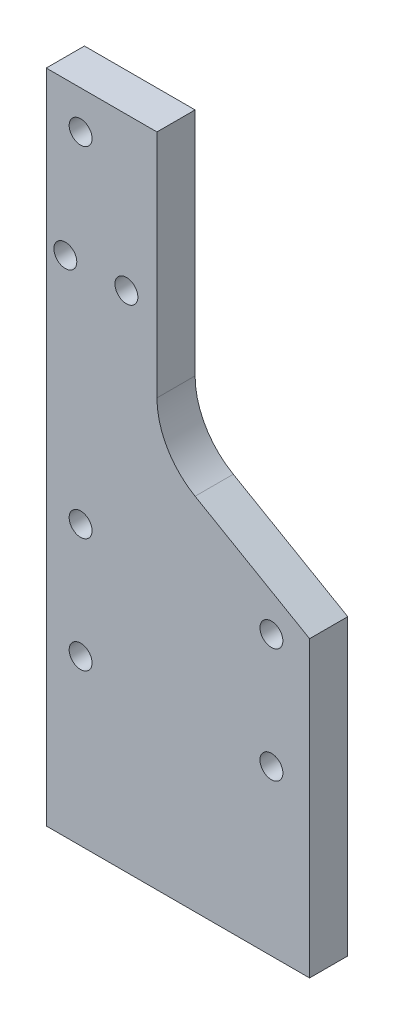
ISO-10303-21;
HEADER;
FILE_DESCRIPTION(('STEP AP214'),'2;1');
FILE_NAME('part.step','',(''),(''),'','','');
FILE_SCHEMA(('AUTOMOTIVE_DESIGN { 1 0 10303 214 1 1 1 1 }'));
ENDSEC;
DATA;
#1=APPLICATION_CONTEXT('core data for automotive mechanical design processes');
#2=APPLICATION_PROTOCOL_DEFINITION('international standard','automotive_design',2000,#1);
#3=PRODUCT_CONTEXT('',#1,'mechanical');
#4=PRODUCT('Part','Part','',(#3));
#5=PRODUCT_RELATED_PRODUCT_CATEGORY('part','',(#4));
#6=PRODUCT_DEFINITION_FORMATION('','',#4);
#7=PRODUCT_DEFINITION_CONTEXT('part definition',#1,'design');
#8=PRODUCT_DEFINITION('design','',#6,#7);
#9=PRODUCT_DEFINITION_SHAPE('','',#8);
#10=(LENGTH_UNIT() NAMED_UNIT(*) SI_UNIT(.MILLI.,.METRE.));
#11=(NAMED_UNIT(*) PLANE_ANGLE_UNIT() SI_UNIT($,.RADIAN.));
#12=(NAMED_UNIT(*) SI_UNIT($,.STERADIAN.) SOLID_ANGLE_UNIT());
#13=UNCERTAINTY_MEASURE_WITH_UNIT(LENGTH_MEASURE(1.E-05),#10,'distance_accuracy_value','');
#14=(GEOMETRIC_REPRESENTATION_CONTEXT(3) GLOBAL_UNCERTAINTY_ASSIGNED_CONTEXT((#13)) GLOBAL_UNIT_ASSIGNED_CONTEXT((#10,
#11,#12)) REPRESENTATION_CONTEXT('',''));
#15=CARTESIAN_POINT('',(0.,0.,0.));
#16=DIRECTION('',(0.,0.,1.));
#17=DIRECTION('',(1.,0.,0.));
#18=AXIS2_PLACEMENT_3D('',#15,#16,#17);
#19=CARTESIAN_POINT('',(-20.0000000000004,128.641016151377,-10.0000000000006));
#20=DIRECTION('',(0.,0.,-1.));
#21=DIRECTION('',(1.,0.,0.));
#22=AXIS2_PLACEMENT_3D('',#19,#20,#21);
#23=PLANE('',#22);
#24=DIRECTION('',(-1.,0.,0.));
#25=VECTOR('',#24,1.);
#26=CARTESIAN_POINT('',(-69.0000000000017,17.,-9.99999999999956));
#27=LINE('',#26,#25);
#28=CARTESIAN_POINT('',(1.38777878078145E-13,17.,-9.9999999999969));
#29=VERTEX_POINT('',#28);
#30=CARTESIAN_POINT('',(-69.0000000000017,17.,-9.99999999999956));
#31=VERTEX_POINT('',#30);
#32=EDGE_CURVE('E160',#29,#31,#27,.T.);
#33=ORIENTED_EDGE('',*,*,#32,.T.);
#34=DIRECTION('',(0.,-1.,0.));
#35=VECTOR('',#34,1.);
#36=CARTESIAN_POINT('',(-69.0000000000017,0.,-9.99999999999956));
#37=LINE('',#36,#35);
#38=CARTESIAN_POINT('',(-69.0000000000016,189.,-9.99999999999956));
#39=VERTEX_POINT('',#38);
#40=EDGE_CURVE('E119',#39,#31,#37,.T.);
#41=ORIENTED_EDGE('',*,*,#40,.F.);
#42=DIRECTION('',(-1.,0.,0.));
#43=VECTOR('',#42,1.);
#44=CARTESIAN_POINT('',(-69.0000000000016,189.,-9.99999999999956));
#45=LINE('',#44,#43);
#46=CARTESIAN_POINT('',(-40.0000000000004,189.,-10.0000000000025));
#47=VERTEX_POINT('',#46);
#48=EDGE_CURVE('E117',#47,#39,#45,.T.);
#49=ORIENTED_EDGE('',*,*,#48,.F.);
#50=DIRECTION('',(0.,1.,0.));
#51=VECTOR('',#50,1.);
#52=CARTESIAN_POINT('',(-40.0000000000004,189.,-10.0000000000025));
#53=LINE('',#52,#51);
#54=CARTESIAN_POINT('',(-39.9999999999996,128.641016151377,-10.0000000000012));
#55=VERTEX_POINT('',#54);
#56=EDGE_CURVE('E98',#55,#47,#53,.T.);
#57=ORIENTED_EDGE('',*,*,#56,.F.);
#58=CARTESIAN_POINT('',(-20.0000000000004,128.641016151377,-10.0000000000006));
#59=DIRECTION('',(0.,0.,-1.));
#60=DIRECTION('',(1.,0.,0.));
#61=AXIS2_PLACEMENT_3D('',#58,#59,#60);
#62=CIRCLE('',#61,20.);
#63=CARTESIAN_POINT('',(-30.0000000000012,111.320508075689,-10.0000000000026));
#64=VERTEX_POINT('',#63);
#65=EDGE_CURVE('E108',#64,#55,#62,.T.);
#66=ORIENTED_EDGE('',*,*,#65,.F.);
#67=DIRECTION('',(-0.86602540378445,0.499999999999998,0.));
#68=VECTOR('',#67,1.);
#69=CARTESIAN_POINT('',(-30.0000000000012,111.320508075689,-10.0000000000026));
#70=LINE('',#69,#68);
#71=CARTESIAN_POINT('',(0.,94.,-9.99999999999679));
#72=VERTEX_POINT('',#71);
#73=EDGE_CURVE('E112',#72,#64,#70,.T.);
#74=ORIENTED_EDGE('',*,*,#73,.F.);
#75=DIRECTION('',(0.,1.,0.));
#76=VECTOR('',#75,1.);
#77=CARTESIAN_POINT('',(0.,94.,-9.99999999999679));
#78=LINE('',#77,#76);
#79=EDGE_CURVE('E140',#29,#72,#78,.T.);
#80=ORIENTED_EDGE('',*,*,#79,.F.);
#81=EDGE_LOOP('',(#33,#41,#49,#57,#66,#74,#80));
#82=FACE_BOUND('',#81,.T.);
#83=CARTESIAN_POINT('',(-48.0000000000005,149.,-9.99999999999734));
#84=DIRECTION('',(0.,0.,1.));
#85=DIRECTION('',(1.,0.,0.));
#86=AXIS2_PLACEMENT_3D('',#83,#84,#85);
#87=CIRCLE('',#86,3.);
#88=CARTESIAN_POINT('',(-45.0000000000005,149.,-9.99999999999735));
#89=VERTEX_POINT('',#88);
#90=EDGE_CURVE('E172',#89,#89,#87,.T.);
#91=ORIENTED_EDGE('',*,*,#90,.T.);
#92=EDGE_LOOP('',(#91));
#93=FACE_BOUND('',#92,.T.);
#94=CARTESIAN_POINT('',(-10.000000000001,90.,-9.99999999999934));
#95=DIRECTION('',(0.,0.,1.));
#96=DIRECTION('',(1.,0.,0.));
#97=AXIS2_PLACEMENT_3D('',#94,#95,#96);
#98=CIRCLE('',#97,3.);
#99=CARTESIAN_POINT('',(-7.00000000000099,90.,-9.99999999999935));
#100=VERTEX_POINT('',#99);
#101=EDGE_CURVE('E184',#100,#100,#98,.T.);
#102=ORIENTED_EDGE('',*,*,#101,.T.);
#103=EDGE_LOOP('',(#102));
#104=FACE_BOUND('',#103,.T.);
#105=CARTESIAN_POINT('',(-10.000000000001,59.9999999999999,-9.99999999999934));
#106=DIRECTION('',(0.,0.,1.));
#107=DIRECTION('',(1.,0.,0.));
#108=AXIS2_PLACEMENT_3D('',#105,#106,#107);
#109=CIRCLE('',#108,3.);
#110=CARTESIAN_POINT('',(-7.00000000000101,59.9999999999999,-9.99999999999935));
#111=VERTEX_POINT('',#110);
#112=EDGE_CURVE('E196',#111,#111,#109,.T.);
#113=ORIENTED_EDGE('',*,*,#112,.T.);
#114=EDGE_LOOP('',(#113));
#115=FACE_BOUND('',#114,.T.);
#116=CARTESIAN_POINT('',(-60.0000000000005,59.9999999999999,-10.0000000000011));
#117=DIRECTION('',(0.,0.,1.));
#118=DIRECTION('',(1.,0.,0.));
#119=AXIS2_PLACEMENT_3D('',#116,#117,#118);
#120=CIRCLE('',#119,3.);
#121=CARTESIAN_POINT('',(-57.0000000000005,59.9999999999999,-10.0000000000011));
#122=VERTEX_POINT('',#121);
#123=EDGE_CURVE('E128',#122,#122,#120,.T.);
#124=ORIENTED_EDGE('',*,*,#123,.T.);
#125=EDGE_LOOP('',(#124));
#126=FACE_BOUND('',#125,.T.);
#127=CARTESIAN_POINT('',(-60.0000000000001,90.,-10.0000000000016));
#128=DIRECTION('',(0.,0.,1.));
#129=DIRECTION('',(1.,0.,0.));
#130=AXIS2_PLACEMENT_3D('',#127,#128,#129);
#131=CIRCLE('',#130,3.);
#132=CARTESIAN_POINT('',(-57.0000000000001,90.,-10.0000000000016));
#133=VERTEX_POINT('',#132);
#134=EDGE_CURVE('E190',#133,#133,#131,.T.);
#135=ORIENTED_EDGE('',*,*,#134,.T.);
#136=EDGE_LOOP('',(#135));
#137=FACE_BOUND('',#136,.T.);
#138=CARTESIAN_POINT('',(-64.0000000000006,149.,-10.0000000000027));
#139=DIRECTION('',(0.,0.,1.));
#140=DIRECTION('',(1.,0.,0.));
#141=AXIS2_PLACEMENT_3D('',#138,#139,#140);
#142=CIRCLE('',#141,3.);
#143=CARTESIAN_POINT('',(-61.0000000000006,149.,-10.0000000000027));
#144=VERTEX_POINT('',#143);
#145=EDGE_CURVE('E178',#144,#144,#142,.T.);
#146=ORIENTED_EDGE('',*,*,#145,.T.);
#147=EDGE_LOOP('',(#146));
#148=FACE_BOUND('',#147,.T.);
#149=CARTESIAN_POINT('',(-60.0000000000007,179.,-10.0000000000026));
#150=DIRECTION('',(0.,0.,1.));
#151=DIRECTION('',(1.,0.,0.));
#152=AXIS2_PLACEMENT_3D('',#149,#150,#151);
#153=CIRCLE('',#152,3.);
#154=CARTESIAN_POINT('',(-57.0000000000007,179.,-10.0000000000026));
#155=VERTEX_POINT('',#154);
#156=EDGE_CURVE('E166',#155,#155,#153,.T.);
#157=ORIENTED_EDGE('',*,*,#156,.T.);
#158=EDGE_LOOP('',(#157));
#159=FACE_BOUND('',#158,.T.);
#160=ADVANCED_FACE('F33',(#82,#93,#104,#115,#126,#137,#148,#159),#23,.T.);
#161=CARTESIAN_POINT('',(-20.0000000000005,128.641016151377,5.55111512312578E-13));
#162=DIRECTION('',(0.,0.,-1.));
#163=DIRECTION('',(1.,0.,0.));
#164=AXIS2_PLACEMENT_3D('',#161,#162,#163);
#165=PLANE('',#164);
#166=CARTESIAN_POINT('',(-48.0000000000006,149.,-1.4432899320127E-12));
#167=DIRECTION('',(0.,0.,1.));
#168=DIRECTION('',(1.,0.,0.));
#169=AXIS2_PLACEMENT_3D('',#166,#167,#168);
#170=CIRCLE('',#169,3.);
#171=CARTESIAN_POINT('',(-45.0000000000006,149.,-1.44916023625541E-12));
#172=VERTEX_POINT('',#171);
#173=EDGE_CURVE('E169',#172,#172,#170,.T.);
#174=ORIENTED_EDGE('',*,*,#173,.F.);
#175=EDGE_LOOP('',(#174));
#176=FACE_BOUND('',#175,.T.);
#177=CARTESIAN_POINT('',(-10.0000000000003,90.,-2.99760216648792E-12));
#178=DIRECTION('',(0.,0.,1.));
#179=DIRECTION('',(1.,0.,0.));
#180=AXIS2_PLACEMENT_3D('',#177,#178,#179);
#181=CIRCLE('',#180,3.);
#182=CARTESIAN_POINT('',(-7.00000000000029,90.,-3.00347247073063E-12));
#183=VERTEX_POINT('',#182);
#184=EDGE_CURVE('E181',#183,#183,#181,.T.);
#185=ORIENTED_EDGE('',*,*,#184,.F.);
#186=EDGE_LOOP('',(#185));
#187=FACE_BOUND('',#186,.T.);
#188=CARTESIAN_POINT('',(-10.0000000000013,60.,-3.10862446895044E-12));
#189=DIRECTION('',(0.,0.,1.));
#190=DIRECTION('',(1.,0.,0.));
#191=AXIS2_PLACEMENT_3D('',#188,#189,#190);
#192=CIRCLE('',#191,3.);
#193=CARTESIAN_POINT('',(-7.00000000000124,60.,-3.11449477319314E-12));
#194=VERTEX_POINT('',#193);
#195=EDGE_CURVE('E193',#194,#194,#192,.T.);
#196=ORIENTED_EDGE('',*,*,#195,.F.);
#197=EDGE_LOOP('',(#196));
#198=FACE_BOUND('',#197,.T.);
#199=DIRECTION('',(0.,1.,0.));
#200=VECTOR('',#199,1.);
#201=CARTESIAN_POINT('',(0.,94.,0.));
#202=LINE('',#201,#200);
#203=CARTESIAN_POINT('',(0.,17.,0.));
#204=VERTEX_POINT('',#203);
#205=CARTESIAN_POINT('',(0.,94.,0.));
#206=VERTEX_POINT('',#205);
#207=EDGE_CURVE('E124',#204,#206,#202,.T.);
#208=ORIENTED_EDGE('',*,*,#207,.T.);
#209=DIRECTION('',(-0.86602540378445,0.499999999999998,0.));
#210=VECTOR('',#209,1.);
#211=CARTESIAN_POINT('',(-30.0000000000005,111.320508075689,2.44249065417534E-12));
#212=LINE('',#211,#210);
#213=CARTESIAN_POINT('',(-30.0000000000005,111.320508075689,2.44249065417534E-12));
#214=VERTEX_POINT('',#213);
#215=EDGE_CURVE('E127',#206,#214,#212,.T.);
#216=ORIENTED_EDGE('',*,*,#215,.T.);
#217=CARTESIAN_POINT('',(-20.0000000000005,128.641016151377,5.55111512312578E-13));
#218=DIRECTION('',(0.,0.,-1.));
#219=DIRECTION('',(1.,0.,0.));
#220=AXIS2_PLACEMENT_3D('',#217,#218,#219);
#221=CIRCLE('',#220,20.);
#222=CARTESIAN_POINT('',(-39.9999999999997,128.641016151377,2.22044604925031E-13));
#223=VERTEX_POINT('',#222);
#224=EDGE_CURVE('E131',#214,#223,#221,.T.);
#225=ORIENTED_EDGE('',*,*,#224,.T.);
#226=DIRECTION('',(0.,1.,0.));
#227=VECTOR('',#226,1.);
#228=CARTESIAN_POINT('',(-40.0000000000005,189.,-2.44249065417534E-12));
#229=LINE('',#228,#227);
#230=CARTESIAN_POINT('',(-40.0000000000005,189.,-2.44249065417534E-12));
#231=VERTEX_POINT('',#230);
#232=EDGE_CURVE('E101',#223,#231,#229,.T.);
#233=ORIENTED_EDGE('',*,*,#232,.T.);
#234=DIRECTION('',(-1.,0.,0.));
#235=VECTOR('',#234,1.);
#236=CARTESIAN_POINT('',(-69.0000000000001,189.,-4.44089209850063E-13));
#237=LINE('',#236,#235);
#238=CARTESIAN_POINT('',(-69.0000000000001,189.,-4.44089209850063E-13));
#239=VERTEX_POINT('',#238);
#240=EDGE_CURVE('E134',#231,#239,#237,.T.);
#241=ORIENTED_EDGE('',*,*,#240,.T.);
#242=DIRECTION('',(0.,-1.,0.));
#243=VECTOR('',#242,1.);
#244=CARTESIAN_POINT('',(-69.0000000000002,0.,7.7715611723761E-13));
#245=LINE('',#244,#243);
#246=CARTESIAN_POINT('',(-69.0000000000002,17.,7.7715611723761E-13));
#247=VERTEX_POINT('',#246);
#248=EDGE_CURVE('E137',#239,#247,#245,.T.);
#249=ORIENTED_EDGE('',*,*,#248,.T.);
#250=DIRECTION('',(-1.,0.,0.));
#251=VECTOR('',#250,1.);
#252=CARTESIAN_POINT('',(-69.0000000000002,17.,7.7715611723761E-13));
#253=LINE('',#252,#251);
#254=EDGE_CURVE('E149',#204,#247,#253,.T.);
#255=ORIENTED_EDGE('',*,*,#254,.F.);
#256=EDGE_LOOP('',(#208,#216,#225,#233,#241,#249,#255));
#257=FACE_BOUND('',#256,.T.);
#258=CARTESIAN_POINT('',(-60.0000000000006,60.,-6.66133814775094E-13));
#259=DIRECTION('',(0.,0.,1.));
#260=DIRECTION('',(1.,0.,0.));
#261=AXIS2_PLACEMENT_3D('',#258,#259,#260);
#262=CIRCLE('',#261,3.);
#263=CARTESIAN_POINT('',(-57.0000000000006,60.,-6.72004119017799E-13));
#264=VERTEX_POINT('',#263);
#265=EDGE_CURVE('E199',#264,#264,#262,.T.);
#266=ORIENTED_EDGE('',*,*,#265,.F.);
#267=EDGE_LOOP('',(#266));
#268=FACE_BOUND('',#267,.T.);
#269=CARTESIAN_POINT('',(-60.0000000000005,90.,-5.55111512312578E-13));
#270=DIRECTION('',(0.,0.,1.));
#271=DIRECTION('',(1.,0.,0.));
#272=AXIS2_PLACEMENT_3D('',#269,#270,#271);
#273=CIRCLE('',#272,3.);
#274=CARTESIAN_POINT('',(-57.0000000000005,90.,-5.60981816555284E-13));
#275=VERTEX_POINT('',#274);
#276=EDGE_CURVE('E187',#275,#275,#273,.T.);
#277=ORIENTED_EDGE('',*,*,#276,.F.);
#278=EDGE_LOOP('',(#277));
#279=FACE_BOUND('',#278,.T.);
#280=CARTESIAN_POINT('',(-64.0000000000009,149.,1.66533453693773E-12));
#281=DIRECTION('',(0.,0.,1.));
#282=DIRECTION('',(1.,0.,0.));
#283=AXIS2_PLACEMENT_3D('',#280,#281,#282);
#284=CIRCLE('',#283,3.);
#285=CARTESIAN_POINT('',(-61.0000000000008,149.,1.65946423269503E-12));
#286=VERTEX_POINT('',#285);
#287=EDGE_CURVE('E175',#286,#286,#284,.T.);
#288=ORIENTED_EDGE('',*,*,#287,.F.);
#289=EDGE_LOOP('',(#288));
#290=FACE_BOUND('',#289,.T.);
#291=CARTESIAN_POINT('',(-60.0000000000002,179.,-2.44249065417534E-12));
#292=DIRECTION('',(0.,0.,1.));
#293=DIRECTION('',(1.,0.,0.));
#294=AXIS2_PLACEMENT_3D('',#291,#292,#293);
#295=CIRCLE('',#294,3.);
#296=CARTESIAN_POINT('',(-57.0000000000002,179.,-2.44836095841805E-12));
#297=VERTEX_POINT('',#296);
#298=EDGE_CURVE('E157',#297,#297,#295,.T.);
#299=ORIENTED_EDGE('',*,*,#298,.F.);
#300=EDGE_LOOP('',(#299));
#301=FACE_BOUND('',#300,.T.);
#302=ADVANCED_FACE('F144',(#176,#187,#198,#257,#268,#279,#290,#301),#165,.F.);
#303=CARTESIAN_POINT('',(0.,94.,-9.99999999999679));
#304=DIRECTION('',(-1.,0.,0.));
#305=DIRECTION('',(0.,-1.,0.));
#306=AXIS2_PLACEMENT_3D('',#303,#304,#305);
#307=PLANE('',#306);
#308=ORIENTED_EDGE('',*,*,#79,.T.);
#309=DIRECTION('',(0.,0.,1.));
#310=VECTOR('',#309,1.);
#311=CARTESIAN_POINT('',(0.,94.,-9.99999999999679));
#312=LINE('',#311,#310);
#313=EDGE_CURVE('E11',#72,#206,#312,.T.);
#314=ORIENTED_EDGE('',*,*,#313,.T.);
#315=ORIENTED_EDGE('',*,*,#207,.F.);
#316=DIRECTION('',(0.,0.,-1.));
#317=VECTOR('',#316,1.);
#318=CARTESIAN_POINT('',(0.,17.,0.));
#319=LINE('',#318,#317);
#320=EDGE_CURVE('E153',#204,#29,#319,.T.);
#321=ORIENTED_EDGE('',*,*,#320,.T.);
#322=EDGE_LOOP('',(#308,#314,#315,#321));
#323=FACE_BOUND('',#322,.T.);
#324=ADVANCED_FACE('F35',(#323),#307,.F.);
#325=CARTESIAN_POINT('',(-30.0000000000012,111.320508075689,-10.0000000000026));
#326=DIRECTION('',(-0.500000000000001,-0.86602540378444,0.));
#327=DIRECTION('',(0.86602540378445,-0.499999999999998,0.));
#328=AXIS2_PLACEMENT_3D('',#325,#326,#327);
#329=PLANE('',#328);
#330=ORIENTED_EDGE('',*,*,#215,.F.);
#331=ORIENTED_EDGE('',*,*,#313,.F.);
#332=ORIENTED_EDGE('',*,*,#73,.T.);
#333=DIRECTION('',(0.,0.,1.));
#334=VECTOR('',#333,1.);
#335=CARTESIAN_POINT('',(-30.0000000000012,111.320508075689,-10.0000000000026));
#336=LINE('',#335,#334);
#337=EDGE_CURVE('E41',#64,#214,#336,.T.);
#338=ORIENTED_EDGE('',*,*,#337,.T.);
#339=EDGE_LOOP('',(#330,#331,#332,#338));
#340=FACE_BOUND('',#339,.T.);
#341=ADVANCED_FACE('F142',(#340),#329,.F.);
#342=CARTESIAN_POINT('',(-20.0000000000004,128.641016151377,-10.0000000000006));
#343=DIRECTION('',(0.,0.,1.));
#344=DIRECTION('',(-1.,0.,0.));
#345=AXIS2_PLACEMENT_3D('',#342,#343,#344);
#346=CYLINDRICAL_SURFACE('',#345,20.);
#347=ORIENTED_EDGE('',*,*,#224,.F.);
#348=ORIENTED_EDGE('',*,*,#337,.F.);
#349=ORIENTED_EDGE('',*,*,#65,.T.);
#350=DIRECTION('',(0.,0.,1.));
#351=VECTOR('',#350,1.);
#352=CARTESIAN_POINT('',(-39.9999999999996,128.641016151377,-10.0000000000012));
#353=LINE('',#352,#351);
#354=EDGE_CURVE('E94',#55,#223,#353,.T.);
#355=ORIENTED_EDGE('',*,*,#354,.T.);
#356=EDGE_LOOP('',(#347,#348,#349,#355));
#357=FACE_BOUND('',#356,.T.);
#358=ADVANCED_FACE('F109',(#357),#346,.F.);
#359=CARTESIAN_POINT('',(-40.0000000000004,189.,-10.0000000000025));
#360=DIRECTION('',(-1.,0.,0.));
#361=DIRECTION('',(0.,0.,-1.));
#362=AXIS2_PLACEMENT_3D('',#359,#360,#361);
#363=PLANE('',#362);
#364=ORIENTED_EDGE('',*,*,#232,.F.);
#365=ORIENTED_EDGE('',*,*,#354,.F.);
#366=ORIENTED_EDGE('',*,*,#56,.T.);
#367=DIRECTION('',(0.,0.,1.));
#368=VECTOR('',#367,1.);
#369=CARTESIAN_POINT('',(-40.0000000000004,189.,-10.0000000000025));
#370=LINE('',#369,#368);
#371=EDGE_CURVE('E105',#47,#231,#370,.T.);
#372=ORIENTED_EDGE('',*,*,#371,.T.);
#373=EDGE_LOOP('',(#364,#365,#366,#372));
#374=FACE_BOUND('',#373,.T.);
#375=ADVANCED_FACE('F96',(#374),#363,.F.);
#376=CARTESIAN_POINT('',(-69.0000000000016,189.,-9.99999999999956));
#377=DIRECTION('',(0.,-1.,0.));
#378=DIRECTION('',(0.,0.,1.));
#379=AXIS2_PLACEMENT_3D('',#376,#377,#378);
#380=PLANE('',#379);
#381=ORIENTED_EDGE('',*,*,#240,.F.);
#382=ORIENTED_EDGE('',*,*,#371,.F.);
#383=ORIENTED_EDGE('',*,*,#48,.T.);
#384=DIRECTION('',(0.,0.,1.));
#385=VECTOR('',#384,1.);
#386=CARTESIAN_POINT('',(-69.0000000000016,189.,-9.99999999999956));
#387=LINE('',#386,#385);
#388=EDGE_CURVE('E56',#39,#239,#387,.T.);
#389=ORIENTED_EDGE('',*,*,#388,.T.);
#390=EDGE_LOOP('',(#381,#382,#383,#389));
#391=FACE_BOUND('',#390,.T.);
#392=ADVANCED_FACE('F162',(#391),#380,.F.);
#393=CARTESIAN_POINT('',(-69.0000000000017,0.,-9.99999999999956));
#394=DIRECTION('',(1.,0.,0.));
#395=DIRECTION('',(0.,0.,1.));
#396=AXIS2_PLACEMENT_3D('',#393,#394,#395);
#397=PLANE('',#396);
#398=ORIENTED_EDGE('',*,*,#248,.F.);
#399=ORIENTED_EDGE('',*,*,#388,.F.);
#400=ORIENTED_EDGE('',*,*,#40,.T.);
#401=DIRECTION('',(0.,0.,-1.));
#402=VECTOR('',#401,1.);
#403=CARTESIAN_POINT('',(-69.0000000000002,17.,7.7715611723761E-13));
#404=LINE('',#403,#402);
#405=EDGE_CURVE('E48',#247,#31,#404,.T.);
#406=ORIENTED_EDGE('',*,*,#405,.F.);
#407=EDGE_LOOP('',(#398,#399,#400,#406));
#408=FACE_BOUND('',#407,.T.);
#409=ADVANCED_FACE('F156',(#408),#397,.F.);
#410=CARTESIAN_POINT('',(-60.0000000000005,59.9999999999999,-10.0000000000011));
#411=DIRECTION('',(0.,0.,1.));
#412=DIRECTION('',(-1.,0.,0.));
#413=AXIS2_PLACEMENT_3D('',#410,#411,#412);
#414=CYLINDRICAL_SURFACE('',#413,3.);
#415=ORIENTED_EDGE('',*,*,#123,.F.);
#416=EDGE_LOOP('',(#415));
#417=FACE_BOUND('',#416,.T.);
#418=ORIENTED_EDGE('',*,*,#265,.T.);
#419=EDGE_LOOP('',(#418));
#420=FACE_BOUND('',#419,.T.);
#421=ADVANCED_FACE('F208',(#417,#420),#414,.F.);
#422=CARTESIAN_POINT('',(-10.000000000001,59.9999999999999,-9.99999999999934));
#423=DIRECTION('',(0.,0.,1.));
#424=DIRECTION('',(-1.,0.,0.));
#425=AXIS2_PLACEMENT_3D('',#422,#423,#424);
#426=CYLINDRICAL_SURFACE('',#425,3.);
#427=ORIENTED_EDGE('',*,*,#112,.F.);
#428=EDGE_LOOP('',(#427));
#429=FACE_BOUND('',#428,.T.);
#430=ORIENTED_EDGE('',*,*,#195,.T.);
#431=EDGE_LOOP('',(#430));
#432=FACE_BOUND('',#431,.T.);
#433=ADVANCED_FACE('F284',(#429,#432),#426,.F.);
#434=CARTESIAN_POINT('',(-60.0000000000001,90.,-10.0000000000016));
#435=DIRECTION('',(0.,0.,1.));
#436=DIRECTION('',(-1.,0.,0.));
#437=AXIS2_PLACEMENT_3D('',#434,#435,#436);
#438=CYLINDRICAL_SURFACE('',#437,3.);
#439=ORIENTED_EDGE('',*,*,#134,.F.);
#440=EDGE_LOOP('',(#439));
#441=FACE_BOUND('',#440,.T.);
#442=ORIENTED_EDGE('',*,*,#276,.T.);
#443=EDGE_LOOP('',(#442));
#444=FACE_BOUND('',#443,.T.);
#445=ADVANCED_FACE('F291',(#441,#444),#438,.F.);
#446=CARTESIAN_POINT('',(-10.000000000001,90.,-9.99999999999934));
#447=DIRECTION('',(0.,0.,1.));
#448=DIRECTION('',(-1.,0.,0.));
#449=AXIS2_PLACEMENT_3D('',#446,#447,#448);
#450=CYLINDRICAL_SURFACE('',#449,3.);
#451=ORIENTED_EDGE('',*,*,#101,.F.);
#452=EDGE_LOOP('',(#451));
#453=FACE_BOUND('',#452,.T.);
#454=ORIENTED_EDGE('',*,*,#184,.T.);
#455=EDGE_LOOP('',(#454));
#456=FACE_BOUND('',#455,.T.);
#457=ADVANCED_FACE('F298',(#453,#456),#450,.F.);
#458=CARTESIAN_POINT('',(-64.0000000000006,149.,-10.0000000000027));
#459=DIRECTION('',(0.,0.,1.));
#460=DIRECTION('',(-1.,0.,0.));
#461=AXIS2_PLACEMENT_3D('',#458,#459,#460);
#462=CYLINDRICAL_SURFACE('',#461,3.);
#463=ORIENTED_EDGE('',*,*,#145,.F.);
#464=EDGE_LOOP('',(#463));
#465=FACE_BOUND('',#464,.T.);
#466=ORIENTED_EDGE('',*,*,#287,.T.);
#467=EDGE_LOOP('',(#466));
#468=FACE_BOUND('',#467,.T.);
#469=ADVANCED_FACE('F229',(#465,#468),#462,.F.);
#470=CARTESIAN_POINT('',(-48.0000000000005,149.,-9.99999999999734));
#471=DIRECTION('',(0.,0.,1.));
#472=DIRECTION('',(-1.,0.,0.));
#473=AXIS2_PLACEMENT_3D('',#470,#471,#472);
#474=CYLINDRICAL_SURFACE('',#473,3.);
#475=ORIENTED_EDGE('',*,*,#90,.F.);
#476=EDGE_LOOP('',(#475));
#477=FACE_BOUND('',#476,.T.);
#478=ORIENTED_EDGE('',*,*,#173,.T.);
#479=EDGE_LOOP('',(#478));
#480=FACE_BOUND('',#479,.T.);
#481=ADVANCED_FACE('F221',(#477,#480),#474,.F.);
#482=CARTESIAN_POINT('',(-60.0000000000007,179.,-10.0000000000026));
#483=DIRECTION('',(0.,0.,1.));
#484=DIRECTION('',(-1.,0.,0.));
#485=AXIS2_PLACEMENT_3D('',#482,#483,#484);
#486=CYLINDRICAL_SURFACE('',#485,3.);
#487=ORIENTED_EDGE('',*,*,#156,.F.);
#488=EDGE_LOOP('',(#487));
#489=FACE_BOUND('',#488,.T.);
#490=ORIENTED_EDGE('',*,*,#298,.T.);
#491=EDGE_LOOP('',(#490));
#492=FACE_BOUND('',#491,.T.);
#493=ADVANCED_FACE('F219',(#489,#492),#486,.F.);
#494=CARTESIAN_POINT('',(-69.0000000000002,17.,7.7715611723761E-13));
#495=DIRECTION('',(0.,1.,0.));
#496=DIRECTION('',(0.,0.,-1.));
#497=AXIS2_PLACEMENT_3D('',#494,#495,#496);
#498=PLANE('',#497);
#499=ORIENTED_EDGE('',*,*,#32,.F.);
#500=ORIENTED_EDGE('',*,*,#320,.F.);
#501=ORIENTED_EDGE('',*,*,#254,.T.);
#502=ORIENTED_EDGE('',*,*,#405,.T.);
#503=EDGE_LOOP('',(#499,#500,#501,#502));
#504=FACE_BOUND('',#503,.T.);
#505=ADVANCED_FACE('F159',(#504),#498,.F.);
#506=CLOSED_SHELL('',(#160,#302,#324,#341,#358,#375,#392,#409,#421,#433,#445,#457,#469,#481,
#493,#505));
#507=MANIFOLD_SOLID_BREP('B2',#506);
#508=ADVANCED_BREP_SHAPE_REPRESENTATION('',(#18,#507),#14);
#509=SHAPE_DEFINITION_REPRESENTATION(#9,#508);
ENDSEC;
END-ISO-10303-21;
